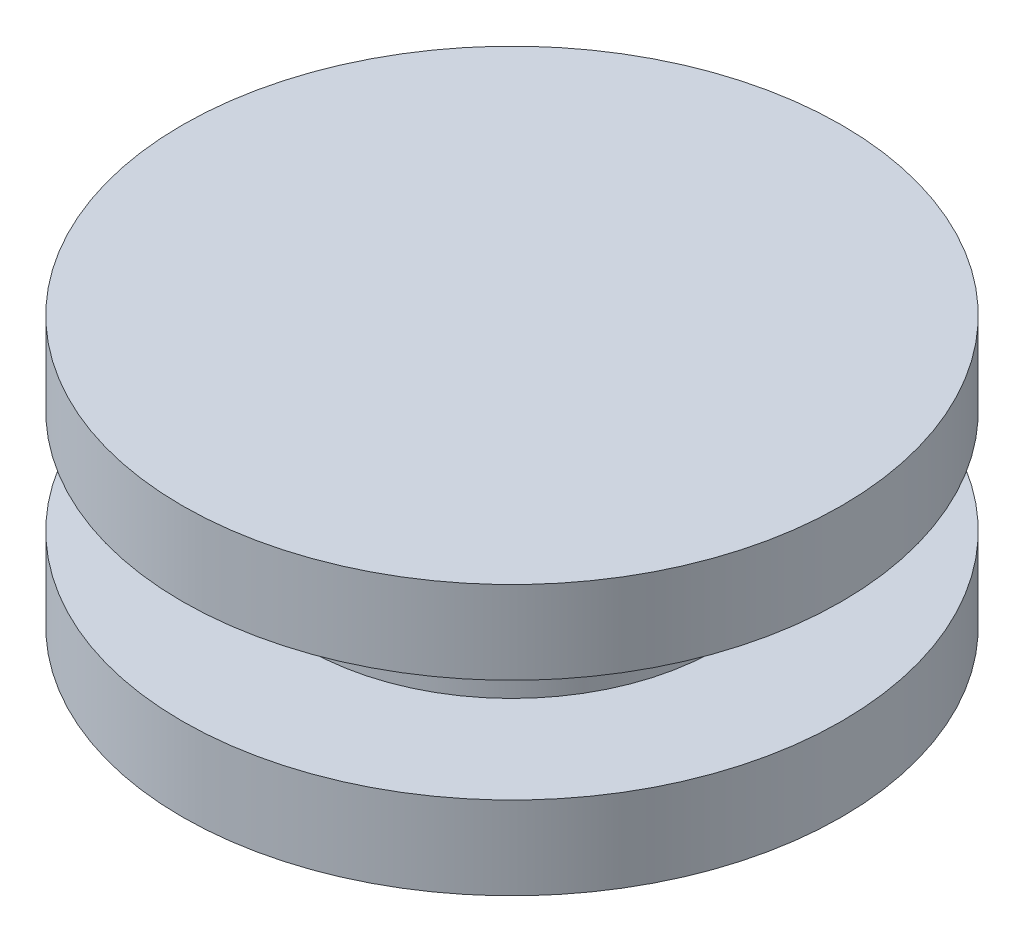
ISO-10303-21;
HEADER;
FILE_DESCRIPTION(('STEP AP214'),'2;1');
FILE_NAME('part.step','',(''),(''),'','','');
FILE_SCHEMA(('AUTOMOTIVE_DESIGN { 1 0 10303 214 1 1 1 1 }'));
ENDSEC;
DATA;
#1=APPLICATION_CONTEXT('core data for automotive mechanical design processes');
#2=APPLICATION_PROTOCOL_DEFINITION('international standard','automotive_design',2000,#1);
#3=PRODUCT_CONTEXT('',#1,'mechanical');
#4=PRODUCT('Part','Part','',(#3));
#5=PRODUCT_RELATED_PRODUCT_CATEGORY('part','',(#4));
#6=PRODUCT_DEFINITION_FORMATION('','',#4);
#7=PRODUCT_DEFINITION_CONTEXT('part definition',#1,'design');
#8=PRODUCT_DEFINITION('design','',#6,#7);
#9=PRODUCT_DEFINITION_SHAPE('','',#8);
#10=(LENGTH_UNIT() NAMED_UNIT(*) SI_UNIT(.MILLI.,.METRE.));
#11=(NAMED_UNIT(*) PLANE_ANGLE_UNIT() SI_UNIT($,.RADIAN.));
#12=(NAMED_UNIT(*) SI_UNIT($,.STERADIAN.) SOLID_ANGLE_UNIT());
#13=UNCERTAINTY_MEASURE_WITH_UNIT(LENGTH_MEASURE(1.E-05),#10,'distance_accuracy_value','');
#14=(GEOMETRIC_REPRESENTATION_CONTEXT(3) GLOBAL_UNCERTAINTY_ASSIGNED_CONTEXT((#13)) GLOBAL_UNIT_ASSIGNED_CONTEXT((#10,
#11,#12)) REPRESENTATION_CONTEXT('',''));
#15=CARTESIAN_POINT('',(0.,0.,0.));
#16=DIRECTION('',(0.,0.,1.));
#17=DIRECTION('',(1.,0.,0.));
#18=AXIS2_PLACEMENT_3D('',#15,#16,#17);
#19=CARTESIAN_POINT('',(0.,0.625,0.));
#20=DIRECTION('',(0.,-1.,0.));
#21=DIRECTION('',(0.,0.,-1.));
#22=AXIS2_PLACEMENT_3D('',#19,#20,#21);
#23=CYLINDRICAL_SURFACE('',#22,2.475);
#24=CARTESIAN_POINT('',(0.,0.625,0.));
#25=DIRECTION('',(0.,1.,0.));
#26=DIRECTION('',(0.,0.,1.));
#27=AXIS2_PLACEMENT_3D('',#24,#25,#26);
#28=CIRCLE('',#27,2.475);
#29=CARTESIAN_POINT('',(0.,0.625,2.475));
#30=VERTEX_POINT('',#29);
#31=EDGE_CURVE('E10',#30,#30,#28,.T.);
#32=ORIENTED_EDGE('',*,*,#31,.F.);
#33=EDGE_LOOP('',(#32));
#34=FACE_BOUND('',#33,.T.);
#35=CARTESIAN_POINT('',(0.,-0.625,0.));
#36=DIRECTION('',(0.,1.,0.));
#37=DIRECTION('',(0.,0.,1.));
#38=AXIS2_PLACEMENT_3D('',#35,#36,#37);
#39=CIRCLE('',#38,2.475);
#40=CARTESIAN_POINT('',(0.,-0.625,2.475));
#41=VERTEX_POINT('',#40);
#42=EDGE_CURVE('E35',#41,#41,#39,.T.);
#43=ORIENTED_EDGE('',*,*,#42,.T.);
#44=EDGE_LOOP('',(#43));
#45=FACE_BOUND('',#44,.T.);
#46=ADVANCED_FACE('F32',(#34,#45),#23,.T.);
#47=CARTESIAN_POINT('',(0.,1.625,0.));
#48=DIRECTION('',(0.,-1.,0.));
#49=DIRECTION('',(0.,0.,-1.));
#50=AXIS2_PLACEMENT_3D('',#47,#48,#49);
#51=CYLINDRICAL_SURFACE('',#50,3.975);
#52=CARTESIAN_POINT('',(0.,1.625,0.));
#53=DIRECTION('',(0.,1.,0.));
#54=DIRECTION('',(0.,0.,1.));
#55=AXIS2_PLACEMENT_3D('',#52,#53,#54);
#56=CIRCLE('',#55,3.975);
#57=CARTESIAN_POINT('',(0.,1.625,3.975));
#58=VERTEX_POINT('',#57);
#59=EDGE_CURVE('E39',#58,#58,#56,.T.);
#60=ORIENTED_EDGE('',*,*,#59,.F.);
#61=EDGE_LOOP('',(#60));
#62=FACE_BOUND('',#61,.T.);
#63=CARTESIAN_POINT('',(0.,0.625,0.));
#64=DIRECTION('',(0.,1.,0.));
#65=DIRECTION('',(0.,0.,1.));
#66=AXIS2_PLACEMENT_3D('',#63,#64,#65);
#67=CIRCLE('',#66,3.975);
#68=CARTESIAN_POINT('',(0.,0.625,3.975));
#69=VERTEX_POINT('',#68);
#70=EDGE_CURVE('E43',#69,#69,#67,.T.);
#71=ORIENTED_EDGE('',*,*,#70,.T.);
#72=EDGE_LOOP('',(#71));
#73=FACE_BOUND('',#72,.T.);
#74=ADVANCED_FACE('F80',(#62,#73),#51,.T.);
#75=CARTESIAN_POINT('',(0.,1.625,0.));
#76=DIRECTION('',(0.,1.,0.));
#77=DIRECTION('',(0.,0.,1.));
#78=AXIS2_PLACEMENT_3D('',#75,#76,#77);
#79=PLANE('',#78);
#80=ORIENTED_EDGE('',*,*,#59,.T.);
#81=EDGE_LOOP('',(#80));
#82=FACE_BOUND('',#81,.T.);
#83=ADVANCED_FACE('F76',(#82),#79,.T.);
#84=CARTESIAN_POINT('',(0.,0.625,0.));
#85=DIRECTION('',(0.,1.,0.));
#86=DIRECTION('',(0.,0.,1.));
#87=AXIS2_PLACEMENT_3D('',#84,#85,#86);
#88=PLANE('',#87);
#89=ORIENTED_EDGE('',*,*,#31,.T.);
#90=EDGE_LOOP('',(#89));
#91=FACE_BOUND('',#90,.T.);
#92=ORIENTED_EDGE('',*,*,#70,.F.);
#93=EDGE_LOOP('',(#92));
#94=FACE_BOUND('',#93,.T.);
#95=ADVANCED_FACE('F68',(#91,#94),#88,.F.);
#96=CARTESIAN_POINT('',(0.,-1.625,0.));
#97=DIRECTION('',(0.,1.,0.));
#98=DIRECTION('',(0.,0.,1.));
#99=AXIS2_PLACEMENT_3D('',#96,#97,#98);
#100=CYLINDRICAL_SURFACE('',#99,3.975);
#101=CARTESIAN_POINT('',(0.,-1.625,0.));
#102=DIRECTION('',(0.,1.,0.));
#103=DIRECTION('',(0.,0.,1.));
#104=AXIS2_PLACEMENT_3D('',#101,#102,#103);
#105=CIRCLE('',#104,3.975);
#106=CARTESIAN_POINT('',(0.,-1.625,3.975));
#107=VERTEX_POINT('',#106);
#108=EDGE_CURVE('E51',#107,#107,#105,.T.);
#109=ORIENTED_EDGE('',*,*,#108,.T.);
#110=EDGE_LOOP('',(#109));
#111=FACE_BOUND('',#110,.T.);
#112=CARTESIAN_POINT('',(0.,-0.625,0.));
#113=DIRECTION('',(0.,1.,0.));
#114=DIRECTION('',(0.,0.,1.));
#115=AXIS2_PLACEMENT_3D('',#112,#113,#114);
#116=CIRCLE('',#115,3.975);
#117=CARTESIAN_POINT('',(0.,-0.625,3.975));
#118=VERTEX_POINT('',#117);
#119=EDGE_CURVE('E48',#118,#118,#116,.T.);
#120=ORIENTED_EDGE('',*,*,#119,.F.);
#121=EDGE_LOOP('',(#120));
#122=FACE_BOUND('',#121,.T.);
#123=ADVANCED_FACE('F66',(#111,#122),#100,.T.);
#124=CARTESIAN_POINT('',(0.,-1.625,0.));
#125=DIRECTION('',(0.,-1.,0.));
#126=DIRECTION('',(0.,0.,1.));
#127=AXIS2_PLACEMENT_3D('',#124,#125,#126);
#128=PLANE('',#127);
#129=ORIENTED_EDGE('',*,*,#108,.F.);
#130=EDGE_LOOP('',(#129));
#131=FACE_BOUND('',#130,.T.);
#132=ADVANCED_FACE('F62',(#131),#128,.T.);
#133=CARTESIAN_POINT('',(0.,-0.625,0.));
#134=DIRECTION('',(0.,-1.,0.));
#135=DIRECTION('',(0.,0.,1.));
#136=AXIS2_PLACEMENT_3D('',#133,#134,#135);
#137=PLANE('',#136);
#138=ORIENTED_EDGE('',*,*,#42,.F.);
#139=EDGE_LOOP('',(#138));
#140=FACE_BOUND('',#139,.T.);
#141=ORIENTED_EDGE('',*,*,#119,.T.);
#142=EDGE_LOOP('',(#141));
#143=FACE_BOUND('',#142,.T.);
#144=ADVANCED_FACE('F59',(#140,#143),#137,.F.);
#145=CLOSED_SHELL('',(#46,#74,#83,#95,#123,#132,#144));
#146=MANIFOLD_SOLID_BREP('B2',#145);
#147=ADVANCED_BREP_SHAPE_REPRESENTATION('',(#18,#146),#14);
#148=SHAPE_DEFINITION_REPRESENTATION(#9,#147);
ENDSEC;
END-ISO-10303-21;
